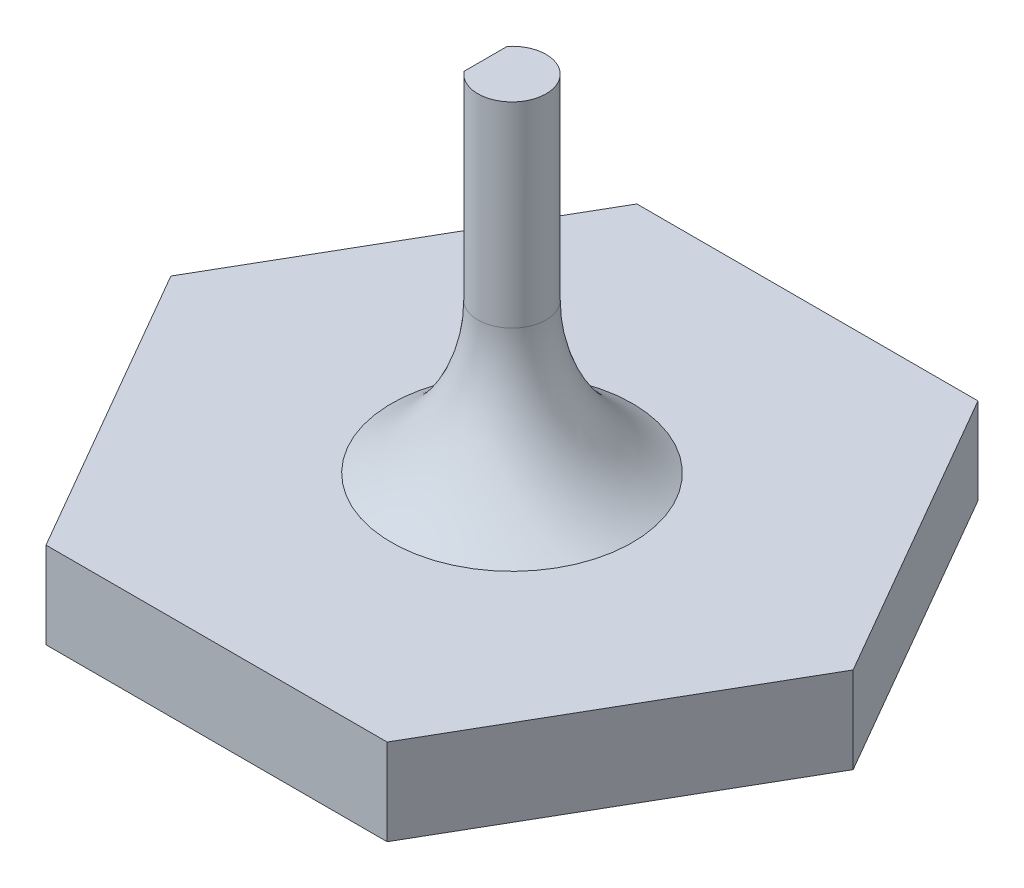
ISO-10303-21;
HEADER;
FILE_DESCRIPTION(('STEP AP214'),'2;1');
FILE_NAME('part.step','',(''),(''),'','','');
FILE_SCHEMA(('AUTOMOTIVE_DESIGN { 1 0 10303 214 1 1 1 1 }'));
ENDSEC;
DATA;
#1=APPLICATION_CONTEXT('core data for automotive mechanical design processes');
#2=APPLICATION_PROTOCOL_DEFINITION('international standard','automotive_design',2000,#1);
#3=PRODUCT_CONTEXT('',#1,'mechanical');
#4=PRODUCT('Part','Part','',(#3));
#5=PRODUCT_RELATED_PRODUCT_CATEGORY('part','',(#4));
#6=PRODUCT_DEFINITION_FORMATION('','',#4);
#7=PRODUCT_DEFINITION_CONTEXT('part definition',#1,'design');
#8=PRODUCT_DEFINITION('design','',#6,#7);
#9=PRODUCT_DEFINITION_SHAPE('','',#8);
#10=(LENGTH_UNIT() NAMED_UNIT(*) SI_UNIT(.MILLI.,.METRE.));
#11=(NAMED_UNIT(*) PLANE_ANGLE_UNIT() SI_UNIT($,.RADIAN.));
#12=(NAMED_UNIT(*) SI_UNIT($,.STERADIAN.) SOLID_ANGLE_UNIT());
#13=UNCERTAINTY_MEASURE_WITH_UNIT(LENGTH_MEASURE(1.E-05),#10,'distance_accuracy_value','');
#14=(GEOMETRIC_REPRESENTATION_CONTEXT(3) GLOBAL_UNCERTAINTY_ASSIGNED_CONTEXT((#13)) GLOBAL_UNIT_ASSIGNED_CONTEXT((#10,
#11,#12)) REPRESENTATION_CONTEXT('',''));
#15=CARTESIAN_POINT('',(0.,0.,0.));
#16=DIRECTION('',(0.,0.,1.));
#17=DIRECTION('',(1.,0.,0.));
#18=AXIS2_PLACEMENT_3D('',#15,#16,#17);
#19=CARTESIAN_POINT('',(0.,10.,0.));
#20=DIRECTION('',(0.,-1.,0.));
#21=DIRECTION('',(0.,0.,-1.));
#22=AXIS2_PLACEMENT_3D('',#19,#20,#21);
#23=CYLINDRICAL_SURFACE('',#22,3.95);
#24=CARTESIAN_POINT('',(0.,27.3205080756888,0.));
#25=DIRECTION('',(0.,-1.,0.));
#26=DIRECTION('',(0.,0.,-1.));
#27=AXIS2_PLACEMENT_3D('',#24,#25,#26);
#28=CIRCLE('',#27,3.95);
#29=CARTESIAN_POINT('',(0.,27.3205080756888,-3.95));
#30=VERTEX_POINT('',#29);
#31=EDGE_CURVE('E167',#30,#30,#28,.T.);
#32=ORIENTED_EDGE('',*,*,#31,.F.);
#33=EDGE_LOOP('',(#32));
#34=FACE_BOUND('',#33,.T.);
#35=CARTESIAN_POINT('',(0.,40.,0.));
#36=DIRECTION('',(0.,1.,0.));
#37=DIRECTION('',(0.,0.,1.));
#38=AXIS2_PLACEMENT_3D('',#35,#36,#37);
#39=CIRCLE('',#38,3.95);
#40=CARTESIAN_POINT('',(-3.05818573667461,40.,-2.5));
#41=VERTEX_POINT('',#40);
#42=CARTESIAN_POINT('',(-3.05818573667461,40.,2.5));
#43=VERTEX_POINT('',#42);
#44=EDGE_CURVE('E176',#41,#43,#39,.T.);
#45=ORIENTED_EDGE('',*,*,#44,.F.);
#46=DIRECTION('',(0.,1.,0.));
#47=VECTOR('',#46,1.);
#48=CARTESIAN_POINT('',(-3.05818573667461,40.,-2.5));
#49=LINE('',#48,#47);
#50=CARTESIAN_POINT('',(-3.05818573667461,50.,-2.5));
#51=VERTEX_POINT('',#50);
#52=EDGE_CURVE('E173',#41,#51,#49,.T.);
#53=ORIENTED_EDGE('',*,*,#52,.T.);
#54=CARTESIAN_POINT('',(0.,50.,0.));
#55=DIRECTION('',(0.,-1.,0.));
#56=DIRECTION('',(0.,0.,-1.));
#57=AXIS2_PLACEMENT_3D('',#54,#55,#56);
#58=CIRCLE('',#57,3.95);
#59=CARTESIAN_POINT('',(-3.05818573667461,50.,2.5));
#60=VERTEX_POINT('',#59);
#61=EDGE_CURVE('E170',#51,#60,#58,.T.);
#62=ORIENTED_EDGE('',*,*,#61,.T.);
#63=DIRECTION('',(0.,1.,0.));
#64=VECTOR('',#63,1.);
#65=CARTESIAN_POINT('',(-3.05818573667461,40.,2.5));
#66=LINE('',#65,#64);
#67=EDGE_CURVE('E54',#43,#60,#66,.T.);
#68=ORIENTED_EDGE('',*,*,#67,.F.);
#69=EDGE_LOOP('',(#45,#53,#62,#68));
#70=FACE_BOUND('',#69,.T.);
#71=ADVANCED_FACE('F39',(#34,#70),#23,.T.);
#72=CARTESIAN_POINT('',(0.,50.,0.));
#73=DIRECTION('',(0.,1.,0.));
#74=DIRECTION('',(0.,0.,1.));
#75=AXIS2_PLACEMENT_3D('',#72,#73,#74);
#76=PLANE('',#75);
#77=ORIENTED_EDGE('',*,*,#61,.F.);
#78=DIRECTION('',(0.,0.,1.));
#79=VECTOR('',#78,1.);
#80=CARTESIAN_POINT('',(-3.05818573667461,50.,0.));
#81=LINE('',#80,#79);
#82=EDGE_CURVE('E178',#51,#60,#81,.T.);
#83=ORIENTED_EDGE('',*,*,#82,.T.);
#84=EDGE_LOOP('',(#77,#83));
#85=FACE_BOUND('',#84,.T.);
#86=ADVANCED_FACE('F193',(#85),#76,.T.);
#87=CARTESIAN_POINT('',(19.75,10.,-34.2080034494853));
#88=DIRECTION('',(0.,0.,1.));
#89=DIRECTION('',(1.,0.,0.));
#90=AXIS2_PLACEMENT_3D('',#87,#88,#89);
#91=PLANE('',#90);
#92=DIRECTION('',(-1.,0.,0.));
#93=VECTOR('',#92,1.);
#94=CARTESIAN_POINT('',(19.75,0.,-34.2080034494853));
#95=LINE('',#94,#93);
#96=CARTESIAN_POINT('',(19.75,0.,-34.2080034494853));
#97=VERTEX_POINT('',#96);
#98=CARTESIAN_POINT('',(-19.75,0.,-34.2080034494853));
#99=VERTEX_POINT('',#98);
#100=EDGE_CURVE('E136',#97,#99,#95,.T.);
#101=ORIENTED_EDGE('',*,*,#100,.T.);
#102=DIRECTION('',(0.,-1.,0.));
#103=VECTOR('',#102,1.);
#104=CARTESIAN_POINT('',(-19.75,10.,-34.2080034494853));
#105=LINE('',#104,#103);
#106=CARTESIAN_POINT('',(-19.75,10.,-34.2080034494853));
#107=VERTEX_POINT('',#106);
#108=EDGE_CURVE('E11',#107,#99,#105,.T.);
#109=ORIENTED_EDGE('',*,*,#108,.F.);
#110=DIRECTION('',(-1.,0.,0.));
#111=VECTOR('',#110,1.);
#112=CARTESIAN_POINT('',(19.75,10.,-34.2080034494853));
#113=LINE('',#112,#111);
#114=CARTESIAN_POINT('',(19.75,10.,-34.2080034494853));
#115=VERTEX_POINT('',#114);
#116=EDGE_CURVE('E148',#115,#107,#113,.T.);
#117=ORIENTED_EDGE('',*,*,#116,.F.);
#118=DIRECTION('',(0.,-1.,0.));
#119=VECTOR('',#118,1.);
#120=CARTESIAN_POINT('',(19.75,10.,-34.2080034494853));
#121=LINE('',#120,#119);
#122=EDGE_CURVE('E132',#115,#97,#121,.T.);
#123=ORIENTED_EDGE('',*,*,#122,.T.);
#124=EDGE_LOOP('',(#101,#109,#117,#123));
#125=FACE_BOUND('',#124,.T.);
#126=ADVANCED_FACE('F41',(#125),#91,.F.);
#127=CARTESIAN_POINT('',(-19.75,10.,-34.2080034494853));
#128=DIRECTION('',(0.866025403784438,0.,0.5));
#129=DIRECTION('',(0.5,0.,-0.866025403784438));
#130=AXIS2_PLACEMENT_3D('',#127,#128,#129);
#131=PLANE('',#130);
#132=DIRECTION('',(-0.5,0.,0.866025403784438));
#133=VECTOR('',#132,1.);
#134=CARTESIAN_POINT('',(-19.75,0.,-34.2080034494853));
#135=LINE('',#134,#133);
#136=CARTESIAN_POINT('',(-39.5,0.,0.));
#137=VERTEX_POINT('',#136);
#138=EDGE_CURVE('E139',#99,#137,#135,.T.);
#139=ORIENTED_EDGE('',*,*,#138,.T.);
#140=DIRECTION('',(0.,-1.,0.));
#141=VECTOR('',#140,1.);
#142=CARTESIAN_POINT('',(-39.5,10.,0.));
#143=LINE('',#142,#141);
#144=CARTESIAN_POINT('',(-39.5,10.,0.));
#145=VERTEX_POINT('',#144);
#146=EDGE_CURVE('E47',#145,#137,#143,.T.);
#147=ORIENTED_EDGE('',*,*,#146,.F.);
#148=DIRECTION('',(-0.5,0.,0.866025403784438));
#149=VECTOR('',#148,1.);
#150=CARTESIAN_POINT('',(-19.75,10.,-34.2080034494853));
#151=LINE('',#150,#149);
#152=EDGE_CURVE('E98',#107,#145,#151,.T.);
#153=ORIENTED_EDGE('',*,*,#152,.F.);
#154=ORIENTED_EDGE('',*,*,#108,.T.);
#155=EDGE_LOOP('',(#139,#147,#153,#154));
#156=FACE_BOUND('',#155,.T.);
#157=ADVANCED_FACE('F201',(#156),#131,.F.);
#158=CARTESIAN_POINT('',(-39.5,10.,0.));
#159=DIRECTION('',(0.866025403784439,0.,-0.5));
#160=DIRECTION('',(-0.5,0.,-0.866025403784439));
#161=AXIS2_PLACEMENT_3D('',#158,#159,#160);
#162=PLANE('',#161);
#163=DIRECTION('',(0.5,0.,0.866025403784439));
#164=VECTOR('',#163,1.);
#165=CARTESIAN_POINT('',(-39.5,0.,0.));
#166=LINE('',#165,#164);
#167=CARTESIAN_POINT('',(-19.75,0.,34.2080034494853));
#168=VERTEX_POINT('',#167);
#169=EDGE_CURVE('E142',#137,#168,#166,.T.);
#170=ORIENTED_EDGE('',*,*,#169,.T.);
#171=DIRECTION('',(0.,-1.,0.));
#172=VECTOR('',#171,1.);
#173=CARTESIAN_POINT('',(-19.75,10.,34.2080034494853));
#174=LINE('',#173,#172);
#175=CARTESIAN_POINT('',(-19.75,10.,34.2080034494853));
#176=VERTEX_POINT('',#175);
#177=EDGE_CURVE('E127',#176,#168,#174,.T.);
#178=ORIENTED_EDGE('',*,*,#177,.F.);
#179=DIRECTION('',(0.5,0.,0.866025403784439));
#180=VECTOR('',#179,1.);
#181=CARTESIAN_POINT('',(-39.5,10.,0.));
#182=LINE('',#181,#180);
#183=EDGE_CURVE('E115',#145,#176,#182,.T.);
#184=ORIENTED_EDGE('',*,*,#183,.F.);
#185=ORIENTED_EDGE('',*,*,#146,.T.);
#186=EDGE_LOOP('',(#170,#178,#184,#185));
#187=FACE_BOUND('',#186,.T.);
#188=ADVANCED_FACE('F154',(#187),#162,.F.);
#189=CARTESIAN_POINT('',(-19.75,10.,34.2080034494853));
#190=DIRECTION('',(0.,0.,-1.));
#191=DIRECTION('',(-1.,0.,0.));
#192=AXIS2_PLACEMENT_3D('',#189,#190,#191);
#193=PLANE('',#192);
#194=DIRECTION('',(1.,0.,0.));
#195=VECTOR('',#194,1.);
#196=CARTESIAN_POINT('',(-19.75,0.,34.2080034494853));
#197=LINE('',#196,#195);
#198=CARTESIAN_POINT('',(19.75,0.,34.2080034494853));
#199=VERTEX_POINT('',#198);
#200=EDGE_CURVE('E124',#168,#199,#197,.T.);
#201=ORIENTED_EDGE('',*,*,#200,.T.);
#202=DIRECTION('',(0.,-1.,0.));
#203=VECTOR('',#202,1.);
#204=CARTESIAN_POINT('',(19.75,10.,34.2080034494853));
#205=LINE('',#204,#203);
#206=CARTESIAN_POINT('',(19.75,10.,34.2080034494853));
#207=VERTEX_POINT('',#206);
#208=EDGE_CURVE('E121',#207,#199,#205,.T.);
#209=ORIENTED_EDGE('',*,*,#208,.F.);
#210=DIRECTION('',(1.,0.,0.));
#211=VECTOR('',#210,1.);
#212=CARTESIAN_POINT('',(-19.75,10.,34.2080034494853));
#213=LINE('',#212,#211);
#214=EDGE_CURVE('E108',#176,#207,#213,.T.);
#215=ORIENTED_EDGE('',*,*,#214,.F.);
#216=ORIENTED_EDGE('',*,*,#177,.T.);
#217=EDGE_LOOP('',(#201,#209,#215,#216));
#218=FACE_BOUND('',#217,.T.);
#219=ADVANCED_FACE('F122',(#218),#193,.F.);
#220=CARTESIAN_POINT('',(19.75,10.,34.2080034494853));
#221=DIRECTION('',(-0.866025403784439,0.,-0.5));
#222=DIRECTION('',(-0.5,0.,0.866025403784439));
#223=AXIS2_PLACEMENT_3D('',#220,#221,#222);
#224=PLANE('',#223);
#225=DIRECTION('',(0.5,0.,-0.866025403784439));
#226=VECTOR('',#225,1.);
#227=CARTESIAN_POINT('',(19.75,0.,34.2080034494853));
#228=LINE('',#227,#226);
#229=CARTESIAN_POINT('',(39.5,0.,0.));
#230=VERTEX_POINT('',#229);
#231=EDGE_CURVE('E145',#199,#230,#228,.T.);
#232=ORIENTED_EDGE('',*,*,#231,.T.);
#233=DIRECTION('',(0.,-1.,0.));
#234=VECTOR('',#233,1.);
#235=CARTESIAN_POINT('',(39.5,10.,0.));
#236=LINE('',#235,#234);
#237=CARTESIAN_POINT('',(39.5,10.,0.));
#238=VERTEX_POINT('',#237);
#239=EDGE_CURVE('E128',#238,#230,#236,.T.);
#240=ORIENTED_EDGE('',*,*,#239,.F.);
#241=DIRECTION('',(0.5,0.,-0.866025403784439));
#242=VECTOR('',#241,1.);
#243=CARTESIAN_POINT('',(19.75,10.,34.2080034494853));
#244=LINE('',#243,#242);
#245=EDGE_CURVE('E112',#207,#238,#244,.T.);
#246=ORIENTED_EDGE('',*,*,#245,.F.);
#247=ORIENTED_EDGE('',*,*,#208,.T.);
#248=EDGE_LOOP('',(#232,#240,#246,#247));
#249=FACE_BOUND('',#248,.T.);
#250=ADVANCED_FACE('F130',(#249),#224,.F.);
#251=CARTESIAN_POINT('',(39.5,10.,0.));
#252=DIRECTION('',(-0.866025403784439,0.,0.5));
#253=DIRECTION('',(0.5,0.,0.866025403784439));
#254=AXIS2_PLACEMENT_3D('',#251,#252,#253);
#255=PLANE('',#254);
#256=DIRECTION('',(-0.5,0.,-0.866025403784439));
#257=VECTOR('',#256,1.);
#258=CARTESIAN_POINT('',(39.5,0.,0.));
#259=LINE('',#258,#257);
#260=EDGE_CURVE('E90',#230,#97,#259,.T.);
#261=ORIENTED_EDGE('',*,*,#260,.T.);
#262=ORIENTED_EDGE('',*,*,#122,.F.);
#263=DIRECTION('',(-0.5,0.,-0.866025403784439));
#264=VECTOR('',#263,1.);
#265=CARTESIAN_POINT('',(39.5,10.,0.));
#266=LINE('',#265,#264);
#267=EDGE_CURVE('E63',#238,#115,#266,.T.);
#268=ORIENTED_EDGE('',*,*,#267,.F.);
#269=ORIENTED_EDGE('',*,*,#239,.T.);
#270=EDGE_LOOP('',(#261,#262,#268,#269));
#271=FACE_BOUND('',#270,.T.);
#272=ADVANCED_FACE('F158',(#271),#255,.F.);
#273=CARTESIAN_POINT('',(0.,10.,0.));
#274=DIRECTION('',(0.,1.,0.));
#275=DIRECTION('',(0.,0.,1.));
#276=AXIS2_PLACEMENT_3D('',#273,#274,#275);
#277=PLANE('',#276);
#278=CARTESIAN_POINT('',(0.,10.,0.));
#279=DIRECTION('',(0.,-1.,0.));
#280=DIRECTION('',(0.,0.,-1.));
#281=AXIS2_PLACEMENT_3D('',#278,#279,#280);
#282=CIRCLE('',#281,13.95);
#283=CARTESIAN_POINT('',(0.,10.,-13.95));
#284=VERTEX_POINT('',#283);
#285=EDGE_CURVE('E140',#284,#284,#282,.T.);
#286=ORIENTED_EDGE('',*,*,#285,.T.);
#287=EDGE_LOOP('',(#286));
#288=FACE_BOUND('',#287,.T.);
#289=ORIENTED_EDGE('',*,*,#116,.T.);
#290=ORIENTED_EDGE('',*,*,#152,.T.);
#291=ORIENTED_EDGE('',*,*,#183,.T.);
#292=ORIENTED_EDGE('',*,*,#214,.T.);
#293=ORIENTED_EDGE('',*,*,#245,.T.);
#294=ORIENTED_EDGE('',*,*,#267,.T.);
#295=EDGE_LOOP('',(#289,#290,#291,#292,#293,#294));
#296=FACE_BOUND('',#295,.T.);
#297=ADVANCED_FACE('F110',(#288,#296),#277,.T.);
#298=CARTESIAN_POINT('',(0.,0.,0.));
#299=DIRECTION('',(0.,1.,0.));
#300=DIRECTION('',(0.,0.,1.));
#301=AXIS2_PLACEMENT_3D('',#298,#299,#300);
#302=PLANE('',#301);
#303=ORIENTED_EDGE('',*,*,#100,.F.);
#304=ORIENTED_EDGE('',*,*,#260,.F.);
#305=ORIENTED_EDGE('',*,*,#231,.F.);
#306=ORIENTED_EDGE('',*,*,#200,.F.);
#307=ORIENTED_EDGE('',*,*,#169,.F.);
#308=ORIENTED_EDGE('',*,*,#138,.F.);
#309=EDGE_LOOP('',(#303,#304,#305,#306,#307,#308));
#310=FACE_BOUND('',#309,.T.);
#311=ADVANCED_FACE('F157',(#310),#302,.F.);
#312=CARTESIAN_POINT('',(0.,27.3205080756888,0.));
#313=DIRECTION('',(0.,-1.,0.));
#314=DIRECTION('',(0.,0.,-1.));
#315=AXIS2_PLACEMENT_3D('',#312,#313,#314);
#316=TOROIDAL_SURFACE('',#315,23.95,20.);
#317=ORIENTED_EDGE('',*,*,#31,.T.);
#318=EDGE_LOOP('',(#317));
#319=FACE_BOUND('',#318,.T.);
#320=ORIENTED_EDGE('',*,*,#285,.F.);
#321=EDGE_LOOP('',(#320));
#322=FACE_BOUND('',#321,.T.);
#323=ADVANCED_FACE('F207',(#319,#322),#316,.F.);
#324=CARTESIAN_POINT('',(-3.05818573667461,40.,0.));
#325=DIRECTION('',(-1.,0.,0.));
#326=DIRECTION('',(0.,0.,1.));
#327=AXIS2_PLACEMENT_3D('',#324,#325,#326);
#328=PLANE('',#327);
#329=ORIENTED_EDGE('',*,*,#82,.F.);
#330=ORIENTED_EDGE('',*,*,#52,.F.);
#331=DIRECTION('',(0.,0.,1.));
#332=VECTOR('',#331,1.);
#333=CARTESIAN_POINT('',(-3.05818573667461,40.,0.));
#334=LINE('',#333,#332);
#335=EDGE_CURVE('E180',#41,#43,#334,.T.);
#336=ORIENTED_EDGE('',*,*,#335,.T.);
#337=ORIENTED_EDGE('',*,*,#67,.T.);
#338=EDGE_LOOP('',(#329,#330,#336,#337));
#339=FACE_BOUND('',#338,.T.);
#340=ADVANCED_FACE('F185',(#339),#328,.T.);
#341=CARTESIAN_POINT('',(0.,40.,0.));
#342=DIRECTION('',(0.,1.,0.));
#343=DIRECTION('',(0.,0.,1.));
#344=AXIS2_PLACEMENT_3D('',#341,#342,#343);
#345=PLANE('',#344);
#346=ORIENTED_EDGE('',*,*,#335,.F.);
#347=ORIENTED_EDGE('',*,*,#44,.T.);
#348=EDGE_LOOP('',(#346,#347));
#349=FACE_BOUND('',#348,.T.);
#350=ADVANCED_FACE('F189',(#349),#345,.T.);
#351=CLOSED_SHELL('',(#71,#86,#126,#157,#188,#219,#250,#272,#297,#311,#323,#340,#350));
#352=MANIFOLD_SOLID_BREP('B2',#351);
#353=ADVANCED_BREP_SHAPE_REPRESENTATION('',(#18,#352),#14);
#354=SHAPE_DEFINITION_REPRESENTATION(#9,#353);
ENDSEC;
END-ISO-10303-21;
